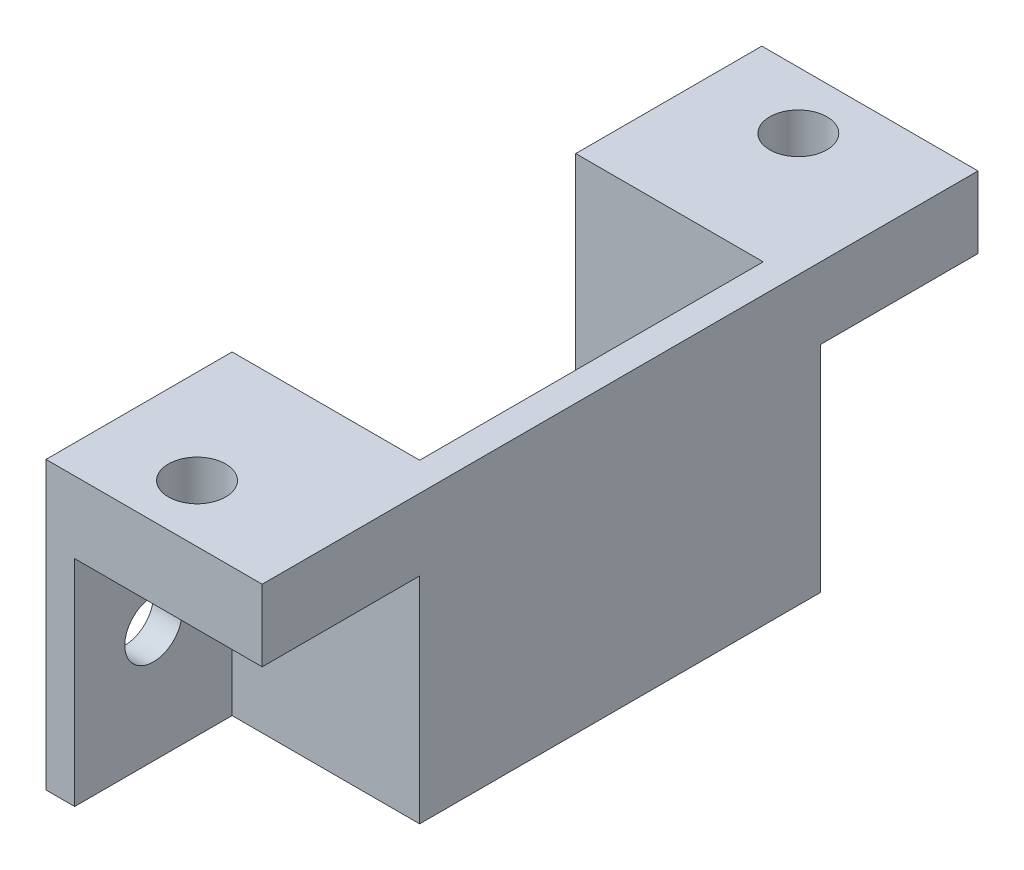
ISO-10303-21;
HEADER;
FILE_DESCRIPTION(('STEP AP214'),'2;1');
FILE_NAME('part.step','',(''),(''),'','','');
FILE_SCHEMA(('AUTOMOTIVE_DESIGN { 1 0 10303 214 1 1 1 1 }'));
ENDSEC;
DATA;
#1=APPLICATION_CONTEXT('core data for automotive mechanical design processes');
#2=APPLICATION_PROTOCOL_DEFINITION('international standard','automotive_design',2000,#1);
#3=PRODUCT_CONTEXT('',#1,'mechanical');
#4=PRODUCT('Part','Part','',(#3));
#5=PRODUCT_RELATED_PRODUCT_CATEGORY('part','',(#4));
#6=PRODUCT_DEFINITION_FORMATION('','',#4);
#7=PRODUCT_DEFINITION_CONTEXT('part definition',#1,'design');
#8=PRODUCT_DEFINITION('design','',#6,#7);
#9=PRODUCT_DEFINITION_SHAPE('','',#8);
#10=(LENGTH_UNIT() NAMED_UNIT(*) SI_UNIT(.MILLI.,.METRE.));
#11=(NAMED_UNIT(*) PLANE_ANGLE_UNIT() SI_UNIT($,.RADIAN.));
#12=(NAMED_UNIT(*) SI_UNIT($,.STERADIAN.) SOLID_ANGLE_UNIT());
#13=UNCERTAINTY_MEASURE_WITH_UNIT(LENGTH_MEASURE(1.E-05),#10,'distance_accuracy_value','');
#14=(GEOMETRIC_REPRESENTATION_CONTEXT(3) GLOBAL_UNCERTAINTY_ASSIGNED_CONTEXT((#13)) GLOBAL_UNIT_ASSIGNED_CONTEXT((#10,
#11,#12)) REPRESENTATION_CONTEXT('',''));
#15=CARTESIAN_POINT('',(0.,0.,0.));
#16=DIRECTION('',(0.,0.,1.));
#17=DIRECTION('',(1.,0.,0.));
#18=AXIS2_PLACEMENT_3D('',#15,#16,#17);
#19=CARTESIAN_POINT('',(2.,20.,0.));
#20=DIRECTION('',(1.,0.,0.));
#21=DIRECTION('',(0.,0.,-1.));
#22=AXIS2_PLACEMENT_3D('',#19,#20,#21);
#23=PLANE('',#22);
#24=CARTESIAN_POINT('',(2.,8.,19.5));
#25=DIRECTION('',(1.,0.,0.));
#26=DIRECTION('',(0.,0.,-1.));
#27=AXIS2_PLACEMENT_3D('',#24,#25,#26);
#28=CIRCLE('',#27,2.);
#29=CARTESIAN_POINT('',(2.,8.,17.5));
#30=VERTEX_POINT('',#29);
#31=EDGE_CURVE('E69',#30,#30,#28,.F.);
#32=ORIENTED_EDGE('',*,*,#31,.T.);
#33=EDGE_LOOP('',(#32));
#34=FACE_BOUND('',#33,.T.);
#35=DIRECTION('',(0.,-1.,0.));
#36=VECTOR('',#35,1.);
#37=CARTESIAN_POINT('',(2.,20.,14.));
#38=LINE('',#37,#36);
#39=CARTESIAN_POINT('',(2.,15.,14.));
#40=VERTEX_POINT('',#39);
#41=CARTESIAN_POINT('',(2.,0.,14.));
#42=VERTEX_POINT('',#41);
#43=EDGE_CURVE('E270',#40,#42,#38,.T.);
#44=ORIENTED_EDGE('',*,*,#43,.F.);
#45=DIRECTION('',(0.,0.,1.));
#46=VECTOR('',#45,1.);
#47=CARTESIAN_POINT('',(2.,15.,0.));
#48=LINE('',#47,#46);
#49=CARTESIAN_POINT('',(2.,15.,25.));
#50=VERTEX_POINT('',#49);
#51=EDGE_CURVE('E208',#40,#50,#48,.T.);
#52=ORIENTED_EDGE('',*,*,#51,.T.);
#53=DIRECTION('',(0.,-1.,0.));
#54=VECTOR('',#53,1.);
#55=CARTESIAN_POINT('',(2.,20.,25.));
#56=LINE('',#55,#54);
#57=CARTESIAN_POINT('',(2.,0.,25.));
#58=VERTEX_POINT('',#57);
#59=EDGE_CURVE('E272',#50,#58,#56,.T.);
#60=ORIENTED_EDGE('',*,*,#59,.T.);
#61=DIRECTION('',(0.,0.,1.));
#62=VECTOR('',#61,1.);
#63=CARTESIAN_POINT('',(2.,0.,0.));
#64=LINE('',#63,#62);
#65=EDGE_CURVE('E259',#42,#58,#64,.T.);
#66=ORIENTED_EDGE('',*,*,#65,.F.);
#67=EDGE_LOOP('',(#44,#52,#60,#66));
#68=FACE_BOUND('',#67,.T.);
#69=ADVANCED_FACE('F65',(#34,#68),#23,.T.);
#70=CARTESIAN_POINT('',(0.,20.,14.));
#71=DIRECTION('',(0.,0.,-1.));
#72=DIRECTION('',(-1.,0.,0.));
#73=AXIS2_PLACEMENT_3D('',#70,#71,#72);
#74=PLANE('',#73);
#75=DIRECTION('',(-1.,0.,0.));
#76=VECTOR('',#75,1.);
#77=CARTESIAN_POINT('',(0.,15.,14.));
#78=LINE('',#77,#76);
#79=CARTESIAN_POINT('',(15.1,15.,14.));
#80=VERTEX_POINT('',#79);
#81=EDGE_CURVE('E195',#80,#40,#78,.T.);
#82=ORIENTED_EDGE('',*,*,#81,.T.);
#83=ORIENTED_EDGE('',*,*,#43,.T.);
#84=DIRECTION('',(1.,0.,0.));
#85=VECTOR('',#84,1.);
#86=CARTESIAN_POINT('',(0.,0.,14.));
#87=LINE('',#86,#85);
#88=CARTESIAN_POINT('',(15.1,0.,14.));
#89=VERTEX_POINT('',#88);
#90=EDGE_CURVE('E262',#42,#89,#87,.T.);
#91=ORIENTED_EDGE('',*,*,#90,.T.);
#92=DIRECTION('',(0.,-1.,0.));
#93=VECTOR('',#92,1.);
#94=CARTESIAN_POINT('',(15.1,20.,14.));
#95=LINE('',#94,#93);
#96=EDGE_CURVE('E268',#80,#89,#95,.T.);
#97=ORIENTED_EDGE('',*,*,#96,.F.);
#98=EDGE_LOOP('',(#82,#83,#91,#97));
#99=FACE_BOUND('',#98,.T.);
#100=ADVANCED_FACE('F321',(#99),#74,.F.);
#101=CARTESIAN_POINT('',(0.,20.,-14.));
#102=DIRECTION('',(0.,0.,-1.));
#103=DIRECTION('',(-1.,0.,0.));
#104=AXIS2_PLACEMENT_3D('',#101,#102,#103);
#105=PLANE('',#104);
#106=DIRECTION('',(-1.,0.,0.));
#107=VECTOR('',#106,1.);
#108=CARTESIAN_POINT('',(0.,15.,-14.));
#109=LINE('',#108,#107);
#110=CARTESIAN_POINT('',(15.1,15.,-14.));
#111=VERTEX_POINT('',#110);
#112=CARTESIAN_POINT('',(2.,15.,-14.));
#113=VERTEX_POINT('',#112);
#114=EDGE_CURVE('E184',#111,#113,#109,.T.);
#115=ORIENTED_EDGE('',*,*,#114,.F.);
#116=DIRECTION('',(0.,-1.,0.));
#117=VECTOR('',#116,1.);
#118=CARTESIAN_POINT('',(15.1,20.,-14.));
#119=LINE('',#118,#117);
#120=CARTESIAN_POINT('',(15.1,0.,-14.));
#121=VERTEX_POINT('',#120);
#122=EDGE_CURVE('E183',#111,#121,#119,.T.);
#123=ORIENTED_EDGE('',*,*,#122,.T.);
#124=DIRECTION('',(1.,0.,0.));
#125=VECTOR('',#124,1.);
#126=CARTESIAN_POINT('',(0.,0.,-14.));
#127=LINE('',#126,#125);
#128=CARTESIAN_POINT('',(2.,0.,-14.));
#129=VERTEX_POINT('',#128);
#130=EDGE_CURVE('E220',#129,#121,#127,.T.);
#131=ORIENTED_EDGE('',*,*,#130,.F.);
#132=DIRECTION('',(0.,-1.,0.));
#133=VECTOR('',#132,1.);
#134=CARTESIAN_POINT('',(2.,20.,-14.));
#135=LINE('',#134,#133);
#136=EDGE_CURVE('E12',#113,#129,#135,.T.);
#137=ORIENTED_EDGE('',*,*,#136,.F.);
#138=EDGE_LOOP('',(#115,#123,#131,#137));
#139=FACE_BOUND('',#138,.T.);
#140=ADVANCED_FACE('F67',(#139),#105,.T.);
#141=CARTESIAN_POINT('',(2.,20.,0.));
#142=DIRECTION('',(-1.,0.,0.));
#143=DIRECTION('',(0.,0.,1.));
#144=AXIS2_PLACEMENT_3D('',#141,#142,#143);
#145=PLANE('',#144);
#146=CARTESIAN_POINT('',(2.,8.,-19.5));
#147=DIRECTION('',(-1.,0.,0.));
#148=DIRECTION('',(0.,0.,1.));
#149=AXIS2_PLACEMENT_3D('',#146,#147,#148);
#150=CIRCLE('',#149,2.);
#151=CARTESIAN_POINT('',(2.,8.,-17.5));
#152=VERTEX_POINT('',#151);
#153=EDGE_CURVE('E217',#152,#152,#150,.F.);
#154=ORIENTED_EDGE('',*,*,#153,.F.);
#155=EDGE_LOOP('',(#154));
#156=FACE_BOUND('',#155,.T.);
#157=DIRECTION('',(0.,-1.,0.));
#158=VECTOR('',#157,1.);
#159=CARTESIAN_POINT('',(2.,20.,-25.));
#160=LINE('',#159,#158);
#161=CARTESIAN_POINT('',(2.,15.,-25.));
#162=VERTEX_POINT('',#161);
#163=CARTESIAN_POINT('',(2.,0.,-25.));
#164=VERTEX_POINT('',#163);
#165=EDGE_CURVE('E74',#162,#164,#160,.T.);
#166=ORIENTED_EDGE('',*,*,#165,.F.);
#167=DIRECTION('',(0.,0.,1.));
#168=VECTOR('',#167,1.);
#169=CARTESIAN_POINT('',(2.,15.,0.));
#170=LINE('',#169,#168);
#171=EDGE_CURVE('E80',#162,#113,#170,.T.);
#172=ORIENTED_EDGE('',*,*,#171,.T.);
#173=ORIENTED_EDGE('',*,*,#136,.T.);
#174=DIRECTION('',(0.,0.,-1.));
#175=VECTOR('',#174,1.);
#176=CARTESIAN_POINT('',(2.,0.,0.));
#177=LINE('',#176,#175);
#178=EDGE_CURVE('E240',#129,#164,#177,.T.);
#179=ORIENTED_EDGE('',*,*,#178,.T.);
#180=EDGE_LOOP('',(#166,#172,#173,#179));
#181=FACE_BOUND('',#180,.T.);
#182=ADVANCED_FACE('F289',(#156,#181),#145,.F.);
#183=CARTESIAN_POINT('',(0.,20.,-25.));
#184=DIRECTION('',(0.,0.,-1.));
#185=DIRECTION('',(-1.,0.,0.));
#186=AXIS2_PLACEMENT_3D('',#183,#184,#185);
#187=PLANE('',#186);
#188=DIRECTION('',(1.,0.,0.));
#189=VECTOR('',#188,1.);
#190=CARTESIAN_POINT('',(0.,0.,-25.));
#191=LINE('',#190,#189);
#192=CARTESIAN_POINT('',(0.,0.,-25.));
#193=VERTEX_POINT('',#192);
#194=EDGE_CURVE('E242',#193,#164,#191,.T.);
#195=ORIENTED_EDGE('',*,*,#194,.F.);
#196=DIRECTION('',(0.,-1.,0.));
#197=VECTOR('',#196,1.);
#198=CARTESIAN_POINT('',(0.,20.,-25.));
#199=LINE('',#198,#197);
#200=CARTESIAN_POINT('',(0.,20.,-25.));
#201=VERTEX_POINT('',#200);
#202=EDGE_CURVE('E286',#201,#193,#199,.T.);
#203=ORIENTED_EDGE('',*,*,#202,.F.);
#204=DIRECTION('',(1.,0.,0.));
#205=VECTOR('',#204,1.);
#206=CARTESIAN_POINT('',(0.,20.,-25.));
#207=LINE('',#206,#205);
#208=CARTESIAN_POINT('',(15.1,20.,-25.));
#209=VERTEX_POINT('',#208);
#210=EDGE_CURVE('E176',#201,#209,#207,.T.);
#211=ORIENTED_EDGE('',*,*,#210,.T.);
#212=DIRECTION('',(0.,1.,0.));
#213=VECTOR('',#212,1.);
#214=CARTESIAN_POINT('',(15.1,15.,-25.));
#215=LINE('',#214,#213);
#216=CARTESIAN_POINT('',(15.1,15.,-25.));
#217=VERTEX_POINT('',#216);
#218=EDGE_CURVE('E170',#217,#209,#215,.T.);
#219=ORIENTED_EDGE('',*,*,#218,.F.);
#220=DIRECTION('',(1.,0.,0.));
#221=VECTOR('',#220,1.);
#222=CARTESIAN_POINT('',(0.,15.,-25.));
#223=LINE('',#222,#221);
#224=EDGE_CURVE('E163',#162,#217,#223,.T.);
#225=ORIENTED_EDGE('',*,*,#224,.F.);
#226=ORIENTED_EDGE('',*,*,#165,.T.);
#227=EDGE_LOOP('',(#195,#203,#211,#219,#225,#226));
#228=FACE_BOUND('',#227,.T.);
#229=ADVANCED_FACE('F174',(#228),#187,.T.);
#230=CARTESIAN_POINT('',(0.,20.,0.));
#231=DIRECTION('',(1.,0.,0.));
#232=DIRECTION('',(0.,0.,-1.));
#233=AXIS2_PLACEMENT_3D('',#230,#231,#232);
#234=PLANE('',#233);
#235=DIRECTION('',(0.,-1.,0.));
#236=VECTOR('',#235,1.);
#237=CARTESIAN_POINT('',(0.,20.,-12.));
#238=LINE('',#237,#236);
#239=CARTESIAN_POINT('',(0.,20.,-12.));
#240=VERTEX_POINT('',#239);
#241=CARTESIAN_POINT('',(0.,0.,-12.));
#242=VERTEX_POINT('',#241);
#243=EDGE_CURVE('E283',#240,#242,#238,.T.);
#244=ORIENTED_EDGE('',*,*,#243,.F.);
#245=DIRECTION('',(0.,0.,1.));
#246=VECTOR('',#245,1.);
#247=CARTESIAN_POINT('',(0.,20.,0.));
#248=LINE('',#247,#246);
#249=EDGE_CURVE('E222',#201,#240,#248,.T.);
#250=ORIENTED_EDGE('',*,*,#249,.F.);
#251=ORIENTED_EDGE('',*,*,#202,.T.);
#252=DIRECTION('',(0.,0.,1.));
#253=VECTOR('',#252,1.);
#254=CARTESIAN_POINT('',(0.,0.,0.));
#255=LINE('',#254,#253);
#256=EDGE_CURVE('E245',#193,#242,#255,.T.);
#257=ORIENTED_EDGE('',*,*,#256,.T.);
#258=EDGE_LOOP('',(#244,#250,#251,#257));
#259=FACE_BOUND('',#258,.T.);
#260=CARTESIAN_POINT('',(0.,8.,-19.5));
#261=DIRECTION('',(1.,0.,0.));
#262=DIRECTION('',(0.,0.,-1.));
#263=AXIS2_PLACEMENT_3D('',#260,#261,#262);
#264=CIRCLE('',#263,2.);
#265=CARTESIAN_POINT('',(0.,8.,-21.5));
#266=VERTEX_POINT('',#265);
#267=EDGE_CURVE('E211',#266,#266,#264,.T.);
#268=ORIENTED_EDGE('',*,*,#267,.T.);
#269=EDGE_LOOP('',(#268));
#270=FACE_BOUND('',#269,.T.);
#271=ADVANCED_FACE('F298',(#259,#270),#234,.F.);
#272=CARTESIAN_POINT('',(0.,20.,-12.));
#273=DIRECTION('',(0.,0.,-1.));
#274=DIRECTION('',(-1.,0.,0.));
#275=AXIS2_PLACEMENT_3D('',#272,#273,#274);
#276=PLANE('',#275);
#277=DIRECTION('',(1.,0.,0.));
#278=VECTOR('',#277,1.);
#279=CARTESIAN_POINT('',(0.,0.,-12.));
#280=LINE('',#279,#278);
#281=CARTESIAN_POINT('',(13.1,0.,-12.));
#282=VERTEX_POINT('',#281);
#283=EDGE_CURVE('E247',#242,#282,#280,.T.);
#284=ORIENTED_EDGE('',*,*,#283,.T.);
#285=DIRECTION('',(0.,-1.,0.));
#286=VECTOR('',#285,1.);
#287=CARTESIAN_POINT('',(13.1,20.,-12.));
#288=LINE('',#287,#286);
#289=CARTESIAN_POINT('',(13.1,20.,-12.));
#290=VERTEX_POINT('',#289);
#291=EDGE_CURVE('E280',#290,#282,#288,.T.);
#292=ORIENTED_EDGE('',*,*,#291,.F.);
#293=DIRECTION('',(1.,0.,0.));
#294=VECTOR('',#293,1.);
#295=CARTESIAN_POINT('',(0.,20.,-12.));
#296=LINE('',#295,#294);
#297=EDGE_CURVE('E225',#240,#290,#296,.T.);
#298=ORIENTED_EDGE('',*,*,#297,.F.);
#299=ORIENTED_EDGE('',*,*,#243,.T.);
#300=EDGE_LOOP('',(#284,#292,#298,#299));
#301=FACE_BOUND('',#300,.T.);
#302=ADVANCED_FACE('F303',(#301),#276,.F.);
#303=CARTESIAN_POINT('',(13.1,20.,0.));
#304=DIRECTION('',(1.,0.,0.));
#305=DIRECTION('',(0.,0.,-1.));
#306=AXIS2_PLACEMENT_3D('',#303,#304,#305);
#307=PLANE('',#306);
#308=DIRECTION('',(0.,0.,1.));
#309=VECTOR('',#308,1.);
#310=CARTESIAN_POINT('',(13.1,0.,0.));
#311=LINE('',#310,#309);
#312=CARTESIAN_POINT('',(13.1,0.,12.));
#313=VERTEX_POINT('',#312);
#314=EDGE_CURVE('E250',#282,#313,#311,.T.);
#315=ORIENTED_EDGE('',*,*,#314,.T.);
#316=DIRECTION('',(0.,-1.,0.));
#317=VECTOR('',#316,1.);
#318=CARTESIAN_POINT('',(13.1,20.,12.));
#319=LINE('',#318,#317);
#320=CARTESIAN_POINT('',(13.1,20.,12.));
#321=VERTEX_POINT('',#320);
#322=EDGE_CURVE('E278',#321,#313,#319,.T.);
#323=ORIENTED_EDGE('',*,*,#322,.F.);
#324=DIRECTION('',(0.,0.,1.));
#325=VECTOR('',#324,1.);
#326=CARTESIAN_POINT('',(13.1,20.,0.));
#327=LINE('',#326,#325);
#328=EDGE_CURVE('E228',#290,#321,#327,.T.);
#329=ORIENTED_EDGE('',*,*,#328,.F.);
#330=ORIENTED_EDGE('',*,*,#291,.T.);
#331=EDGE_LOOP('',(#315,#323,#329,#330));
#332=FACE_BOUND('',#331,.T.);
#333=ADVANCED_FACE('F354',(#332),#307,.F.);
#334=CARTESIAN_POINT('',(0.,20.,12.));
#335=DIRECTION('',(0.,0.,-1.));
#336=DIRECTION('',(-1.,0.,0.));
#337=AXIS2_PLACEMENT_3D('',#334,#335,#336);
#338=PLANE('',#337);
#339=DIRECTION('',(1.,0.,0.));
#340=VECTOR('',#339,1.);
#341=CARTESIAN_POINT('',(0.,0.,12.));
#342=LINE('',#341,#340);
#343=CARTESIAN_POINT('',(0.,0.,12.));
#344=VERTEX_POINT('',#343);
#345=EDGE_CURVE('E253',#344,#313,#342,.T.);
#346=ORIENTED_EDGE('',*,*,#345,.F.);
#347=DIRECTION('',(0.,-1.,0.));
#348=VECTOR('',#347,1.);
#349=CARTESIAN_POINT('',(0.,20.,12.));
#350=LINE('',#349,#348);
#351=CARTESIAN_POINT('',(0.,20.,12.));
#352=VERTEX_POINT('',#351);
#353=EDGE_CURVE('E276',#352,#344,#350,.T.);
#354=ORIENTED_EDGE('',*,*,#353,.F.);
#355=DIRECTION('',(1.,0.,0.));
#356=VECTOR('',#355,1.);
#357=CARTESIAN_POINT('',(0.,20.,12.));
#358=LINE('',#357,#356);
#359=EDGE_CURVE('E230',#352,#321,#358,.T.);
#360=ORIENTED_EDGE('',*,*,#359,.T.);
#361=ORIENTED_EDGE('',*,*,#322,.T.);
#362=EDGE_LOOP('',(#346,#354,#360,#361));
#363=FACE_BOUND('',#362,.T.);
#364=ADVANCED_FACE('F350',(#363),#338,.T.);
#365=DIRECTION('',(0.,-1.,0.));
#366=VECTOR('',#365,1.);
#367=CARTESIAN_POINT('',(0.,20.,25.));
#368=LINE('',#367,#366);
#369=CARTESIAN_POINT('',(0.,20.,25.));
#370=VERTEX_POINT('',#369);
#371=CARTESIAN_POINT('',(0.,0.,25.));
#372=VERTEX_POINT('',#371);
#373=EDGE_CURVE('E274',#370,#372,#368,.T.);
#374=ORIENTED_EDGE('',*,*,#373,.F.);
#375=EDGE_CURVE('E226',#352,#370,#248,.T.);
#376=ORIENTED_EDGE('',*,*,#375,.F.);
#377=ORIENTED_EDGE('',*,*,#353,.T.);
#378=EDGE_CURVE('E248',#344,#372,#255,.T.);
#379=ORIENTED_EDGE('',*,*,#378,.T.);
#380=EDGE_LOOP('',(#374,#376,#377,#379));
#381=FACE_BOUND('',#380,.T.);
#382=CARTESIAN_POINT('',(0.,8.,19.5));
#383=DIRECTION('',(1.,0.,0.));
#384=DIRECTION('',(0.,0.,-1.));
#385=AXIS2_PLACEMENT_3D('',#382,#383,#384);
#386=CIRCLE('',#385,2.);
#387=CARTESIAN_POINT('',(0.,8.,17.5));
#388=VERTEX_POINT('',#387);
#389=EDGE_CURVE('E212',#388,#388,#386,.T.);
#390=ORIENTED_EDGE('',*,*,#389,.T.);
#391=EDGE_LOOP('',(#390));
#392=FACE_BOUND('',#391,.T.);
#393=ADVANCED_FACE('F347',(#381,#392),#234,.F.);
#394=CARTESIAN_POINT('',(0.,20.,25.));
#395=DIRECTION('',(0.,0.,-1.));
#396=DIRECTION('',(-1.,0.,0.));
#397=AXIS2_PLACEMENT_3D('',#394,#395,#396);
#398=PLANE('',#397);
#399=ORIENTED_EDGE('',*,*,#373,.T.);
#400=DIRECTION('',(1.,0.,0.));
#401=VECTOR('',#400,1.);
#402=CARTESIAN_POINT('',(0.,0.,25.));
#403=LINE('',#402,#401);
#404=EDGE_CURVE('E256',#372,#58,#403,.T.);
#405=ORIENTED_EDGE('',*,*,#404,.T.);
#406=ORIENTED_EDGE('',*,*,#59,.F.);
#407=DIRECTION('',(1.,0.,0.));
#408=VECTOR('',#407,1.);
#409=CARTESIAN_POINT('',(0.,15.,25.));
#410=LINE('',#409,#408);
#411=CARTESIAN_POINT('',(15.1,15.,25.));
#412=VERTEX_POINT('',#411);
#413=EDGE_CURVE('E203',#50,#412,#410,.T.);
#414=ORIENTED_EDGE('',*,*,#413,.T.);
#415=DIRECTION('',(0.,1.,0.));
#416=VECTOR('',#415,1.);
#417=CARTESIAN_POINT('',(15.1,15.,25.));
#418=LINE('',#417,#416);
#419=CARTESIAN_POINT('',(15.1,20.,25.));
#420=VERTEX_POINT('',#419);
#421=EDGE_CURVE('E205',#412,#420,#418,.T.);
#422=ORIENTED_EDGE('',*,*,#421,.T.);
#423=DIRECTION('',(1.,0.,0.));
#424=VECTOR('',#423,1.);
#425=CARTESIAN_POINT('',(0.,20.,25.));
#426=LINE('',#425,#424);
#427=EDGE_CURVE('E233',#370,#420,#426,.T.);
#428=ORIENTED_EDGE('',*,*,#427,.F.);
#429=EDGE_LOOP('',(#399,#405,#406,#414,#422,#428));
#430=FACE_BOUND('',#429,.T.);
#431=ADVANCED_FACE('F344',(#430),#398,.F.);
#432=CARTESIAN_POINT('',(15.1,20.,0.));
#433=DIRECTION('',(1.,0.,0.));
#434=DIRECTION('',(0.,0.,-1.));
#435=AXIS2_PLACEMENT_3D('',#432,#433,#434);
#436=PLANE('',#435);
#437=DIRECTION('',(0.,0.,1.));
#438=VECTOR('',#437,1.);
#439=CARTESIAN_POINT('',(15.1,0.,0.));
#440=LINE('',#439,#438);
#441=EDGE_CURVE('E223',#121,#89,#440,.T.);
#442=ORIENTED_EDGE('',*,*,#441,.F.);
#443=ORIENTED_EDGE('',*,*,#122,.F.);
#444=DIRECTION('',(0.,0.,1.));
#445=VECTOR('',#444,1.);
#446=CARTESIAN_POINT('',(15.1,15.,0.));
#447=LINE('',#446,#445);
#448=EDGE_CURVE('E168',#217,#111,#447,.T.);
#449=ORIENTED_EDGE('',*,*,#448,.F.);
#450=ORIENTED_EDGE('',*,*,#218,.T.);
#451=DIRECTION('',(0.,0.,1.));
#452=VECTOR('',#451,1.);
#453=CARTESIAN_POINT('',(15.1,20.,0.));
#454=LINE('',#453,#452);
#455=EDGE_CURVE('E236',#209,#420,#454,.T.);
#456=ORIENTED_EDGE('',*,*,#455,.T.);
#457=ORIENTED_EDGE('',*,*,#421,.F.);
#458=DIRECTION('',(0.,0.,-1.));
#459=VECTOR('',#458,1.);
#460=CARTESIAN_POINT('',(15.1,15.,0.));
#461=LINE('',#460,#459);
#462=EDGE_CURVE('E200',#412,#80,#461,.T.);
#463=ORIENTED_EDGE('',*,*,#462,.T.);
#464=ORIENTED_EDGE('',*,*,#96,.T.);
#465=EDGE_LOOP('',(#442,#443,#449,#450,#456,#457,#463,#464));
#466=FACE_BOUND('',#465,.T.);
#467=ADVANCED_FACE('F182',(#466),#436,.T.);
#468=CARTESIAN_POINT('',(0.,20.,0.));
#469=DIRECTION('',(0.,1.,0.));
#470=DIRECTION('',(0.,0.,1.));
#471=AXIS2_PLACEMENT_3D('',#468,#469,#470);
#472=PLANE('',#471);
#473=ORIENTED_EDGE('',*,*,#455,.F.);
#474=ORIENTED_EDGE('',*,*,#210,.F.);
#475=ORIENTED_EDGE('',*,*,#249,.T.);
#476=ORIENTED_EDGE('',*,*,#297,.T.);
#477=ORIENTED_EDGE('',*,*,#328,.T.);
#478=ORIENTED_EDGE('',*,*,#359,.F.);
#479=ORIENTED_EDGE('',*,*,#375,.T.);
#480=ORIENTED_EDGE('',*,*,#427,.T.);
#481=EDGE_LOOP('',(#473,#474,#475,#476,#477,#478,#479,#480));
#482=FACE_BOUND('',#481,.T.);
#483=CARTESIAN_POINT('',(6.55,20.,21.));
#484=DIRECTION('',(0.,1.,0.));
#485=DIRECTION('',(0.,0.,1.));
#486=AXIS2_PLACEMENT_3D('',#483,#484,#485);
#487=CIRCLE('',#486,2.);
#488=CARTESIAN_POINT('',(6.55,20.,23.));
#489=VERTEX_POINT('',#488);
#490=EDGE_CURVE('E191',#489,#489,#487,.T.);
#491=ORIENTED_EDGE('',*,*,#490,.F.);
#492=EDGE_LOOP('',(#491));
#493=FACE_BOUND('',#492,.T.);
#494=CARTESIAN_POINT('',(6.55,20.,-21.));
#495=DIRECTION('',(0.,1.,0.));
#496=DIRECTION('',(0.,0.,1.));
#497=AXIS2_PLACEMENT_3D('',#494,#495,#496);
#498=CIRCLE('',#497,2.);
#499=CARTESIAN_POINT('',(6.55,20.,-19.));
#500=VERTEX_POINT('',#499);
#501=EDGE_CURVE('E582',#500,#500,#498,.T.);
#502=ORIENTED_EDGE('',*,*,#501,.F.);
#503=EDGE_LOOP('',(#502));
#504=FACE_BOUND('',#503,.T.);
#505=ADVANCED_FACE('F307',(#482,#493,#504),#472,.T.);
#506=CARTESIAN_POINT('',(0.,0.,0.));
#507=DIRECTION('',(0.,1.,0.));
#508=DIRECTION('',(0.,0.,1.));
#509=AXIS2_PLACEMENT_3D('',#506,#507,#508);
#510=PLANE('',#509);
#511=ORIENTED_EDGE('',*,*,#130,.T.);
#512=ORIENTED_EDGE('',*,*,#441,.T.);
#513=ORIENTED_EDGE('',*,*,#90,.F.);
#514=ORIENTED_EDGE('',*,*,#65,.T.);
#515=ORIENTED_EDGE('',*,*,#404,.F.);
#516=ORIENTED_EDGE('',*,*,#378,.F.);
#517=ORIENTED_EDGE('',*,*,#345,.T.);
#518=ORIENTED_EDGE('',*,*,#314,.F.);
#519=ORIENTED_EDGE('',*,*,#283,.F.);
#520=ORIENTED_EDGE('',*,*,#256,.F.);
#521=ORIENTED_EDGE('',*,*,#194,.T.);
#522=ORIENTED_EDGE('',*,*,#178,.F.);
#523=EDGE_LOOP('',(#511,#512,#513,#514,#515,#516,#517,#518,#519,#520,#521,#522));
#524=FACE_BOUND('',#523,.T.);
#525=ADVANCED_FACE('F293',(#524),#510,.F.);
#526=CARTESIAN_POINT('',(15.1,8.,19.5));
#527=DIRECTION('',(-1.,0.,0.));
#528=DIRECTION('',(0.,0.,1.));
#529=AXIS2_PLACEMENT_3D('',#526,#527,#528);
#530=CYLINDRICAL_SURFACE('',#529,2.);
#531=ORIENTED_EDGE('',*,*,#31,.F.);
#532=EDGE_LOOP('',(#531));
#533=FACE_BOUND('',#532,.T.);
#534=ORIENTED_EDGE('',*,*,#389,.F.);
#535=EDGE_LOOP('',(#534));
#536=FACE_BOUND('',#535,.T.);
#537=ADVANCED_FACE('F405',(#533,#536),#530,.F.);
#538=CARTESIAN_POINT('',(15.1,8.,-19.5));
#539=DIRECTION('',(-1.,0.,0.));
#540=DIRECTION('',(0.,0.,1.));
#541=AXIS2_PLACEMENT_3D('',#538,#539,#540);
#542=CYLINDRICAL_SURFACE('',#541,2.);
#543=ORIENTED_EDGE('',*,*,#267,.F.);
#544=EDGE_LOOP('',(#543));
#545=FACE_BOUND('',#544,.T.);
#546=ORIENTED_EDGE('',*,*,#153,.T.);
#547=EDGE_LOOP('',(#546));
#548=FACE_BOUND('',#547,.T.);
#549=ADVANCED_FACE('F412',(#545,#548),#542,.F.);
#550=CARTESIAN_POINT('',(0.,15.,0.));
#551=DIRECTION('',(0.,1.,0.));
#552=DIRECTION('',(0.,0.,1.));
#553=AXIS2_PLACEMENT_3D('',#550,#551,#552);
#554=PLANE('',#553);
#555=ORIENTED_EDGE('',*,*,#51,.F.);
#556=ORIENTED_EDGE('',*,*,#81,.F.);
#557=ORIENTED_EDGE('',*,*,#462,.F.);
#558=ORIENTED_EDGE('',*,*,#413,.F.);
#559=EDGE_LOOP('',(#555,#556,#557,#558));
#560=FACE_BOUND('',#559,.T.);
#561=CARTESIAN_POINT('',(6.55,15.,21.));
#562=DIRECTION('',(0.,1.,0.));
#563=DIRECTION('',(0.,0.,1.));
#564=AXIS2_PLACEMENT_3D('',#561,#562,#563);
#565=CIRCLE('',#564,2.);
#566=CARTESIAN_POINT('',(6.55,15.,23.));
#567=VERTEX_POINT('',#566);
#568=EDGE_CURVE('E192',#567,#567,#565,.T.);
#569=ORIENTED_EDGE('',*,*,#568,.T.);
#570=EDGE_LOOP('',(#569));
#571=FACE_BOUND('',#570,.T.);
#572=ADVANCED_FACE('F317',(#560,#571),#554,.F.);
#573=CARTESIAN_POINT('',(6.55,15.,21.));
#574=DIRECTION('',(0.,1.,0.));
#575=DIRECTION('',(0.,0.,1.));
#576=AXIS2_PLACEMENT_3D('',#573,#574,#575);
#577=CYLINDRICAL_SURFACE('',#576,2.);
#578=ORIENTED_EDGE('',*,*,#568,.F.);
#579=EDGE_LOOP('',(#578));
#580=FACE_BOUND('',#579,.T.);
#581=ORIENTED_EDGE('',*,*,#490,.T.);
#582=EDGE_LOOP('',(#581));
#583=FACE_BOUND('',#582,.T.);
#584=ADVANCED_FACE('F426',(#580,#583),#577,.F.);
#585=CARTESIAN_POINT('',(0.,15.,0.));
#586=DIRECTION('',(0.,-1.,0.));
#587=DIRECTION('',(0.,0.,-1.));
#588=AXIS2_PLACEMENT_3D('',#585,#586,#587);
#589=PLANE('',#588);
#590=CARTESIAN_POINT('',(6.55,15.,-21.));
#591=DIRECTION('',(0.,1.,0.));
#592=DIRECTION('',(0.,0.,1.));
#593=AXIS2_PLACEMENT_3D('',#590,#591,#592);
#594=CIRCLE('',#593,2.);
#595=CARTESIAN_POINT('',(6.55,15.,-19.));
#596=VERTEX_POINT('',#595);
#597=EDGE_CURVE('E186',#596,#596,#594,.T.);
#598=ORIENTED_EDGE('',*,*,#597,.T.);
#599=EDGE_LOOP('',(#598));
#600=FACE_BOUND('',#599,.T.);
#601=ORIENTED_EDGE('',*,*,#171,.F.);
#602=ORIENTED_EDGE('',*,*,#224,.T.);
#603=ORIENTED_EDGE('',*,*,#448,.T.);
#604=ORIENTED_EDGE('',*,*,#114,.T.);
#605=EDGE_LOOP('',(#601,#602,#603,#604));
#606=FACE_BOUND('',#605,.T.);
#607=ADVANCED_FACE('F165',(#600,#606),#589,.T.);
#608=CARTESIAN_POINT('',(6.55,15.,-21.));
#609=DIRECTION('',(0.,1.,0.));
#610=DIRECTION('',(0.,0.,1.));
#611=AXIS2_PLACEMENT_3D('',#608,#609,#610);
#612=CYLINDRICAL_SURFACE('',#611,2.);
#613=ORIENTED_EDGE('',*,*,#597,.F.);
#614=EDGE_LOOP('',(#613));
#615=FACE_BOUND('',#614,.T.);
#616=ORIENTED_EDGE('',*,*,#501,.T.);
#617=EDGE_LOOP('',(#616));
#618=FACE_BOUND('',#617,.T.);
#619=ADVANCED_FACE('F440',(#615,#618),#612,.F.);
#620=CLOSED_SHELL('',(#69,#100,#140,#182,#229,#271,#302,#333,#364,#393,#431,#467,#505,#525,#537,
#549,#572,#584,#607,#619));
#621=MANIFOLD_SOLID_BREP('B2',#620);
#622=ADVANCED_BREP_SHAPE_REPRESENTATION('',(#18,#621),#14);
#623=SHAPE_DEFINITION_REPRESENTATION(#9,#622);
ENDSEC;
END-ISO-10303-21;
